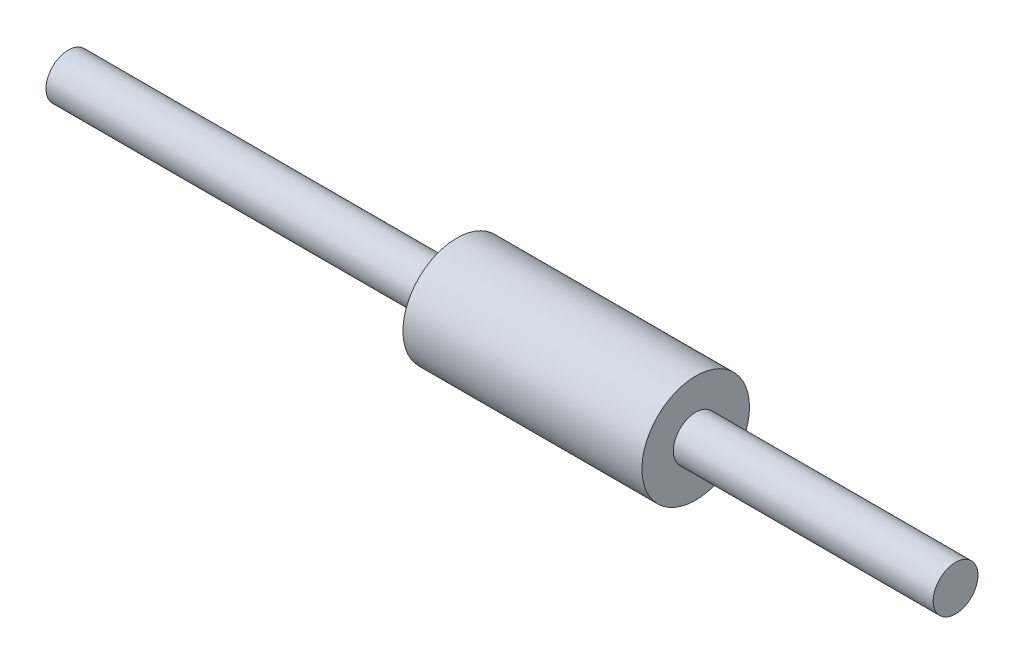
ISO-10303-21;
HEADER;
FILE_DESCRIPTION(('STEP AP214'),'2;1');
FILE_NAME('part.step','',(''),(''),'','','');
FILE_SCHEMA(('AUTOMOTIVE_DESIGN { 1 0 10303 214 1 1 1 1 }'));
ENDSEC;
DATA;
#1=APPLICATION_CONTEXT('core data for automotive mechanical design processes');
#2=APPLICATION_PROTOCOL_DEFINITION('international standard','automotive_design',2000,#1);
#3=PRODUCT_CONTEXT('',#1,'mechanical');
#4=PRODUCT('Part','Part','',(#3));
#5=PRODUCT_RELATED_PRODUCT_CATEGORY('part','',(#4));
#6=PRODUCT_DEFINITION_FORMATION('','',#4);
#7=PRODUCT_DEFINITION_CONTEXT('part definition',#1,'design');
#8=PRODUCT_DEFINITION('design','',#6,#7);
#9=PRODUCT_DEFINITION_SHAPE('','',#8);
#10=(LENGTH_UNIT() NAMED_UNIT(*) SI_UNIT(.MILLI.,.METRE.));
#11=(NAMED_UNIT(*) PLANE_ANGLE_UNIT() SI_UNIT($,.RADIAN.));
#12=(NAMED_UNIT(*) SI_UNIT($,.STERADIAN.) SOLID_ANGLE_UNIT());
#13=UNCERTAINTY_MEASURE_WITH_UNIT(LENGTH_MEASURE(1.E-05),#10,'distance_accuracy_value','');
#14=(GEOMETRIC_REPRESENTATION_CONTEXT(3) GLOBAL_UNCERTAINTY_ASSIGNED_CONTEXT((#13)) GLOBAL_UNIT_ASSIGNED_CONTEXT((#10,
#11,#12)) REPRESENTATION_CONTEXT('',''));
#15=CARTESIAN_POINT('',(0.,0.,0.));
#16=DIRECTION('',(0.,0.,1.));
#17=DIRECTION('',(1.,0.,0.));
#18=AXIS2_PLACEMENT_3D('',#15,#16,#17);
#19=CARTESIAN_POINT('',(40.,0.,0.));
#20=DIRECTION('',(-1.,0.,0.));
#21=DIRECTION('',(0.,0.,1.));
#22=AXIS2_PLACEMENT_3D('',#19,#20,#21);
#23=PLANE('',#22);
#24=CARTESIAN_POINT('',(40.,0.,0.));
#25=DIRECTION('',(1.,0.,0.));
#26=DIRECTION('',(0.,0.,-1.));
#27=AXIS2_PLACEMENT_3D('',#24,#25,#26);
#28=CIRCLE('',#27,7.5);
#29=CARTESIAN_POINT('',(40.,0.,-7.5));
#30=VERTEX_POINT('',#29);
#31=EDGE_CURVE('E61',#30,#30,#28,.T.);
#32=ORIENTED_EDGE('',*,*,#31,.F.);
#33=EDGE_LOOP('',(#32));
#34=FACE_BOUND('',#33,.T.);
#35=CARTESIAN_POINT('',(40.,0.,0.));
#36=DIRECTION('',(1.,0.,0.));
#37=DIRECTION('',(0.,0.,-1.));
#38=AXIS2_PLACEMENT_3D('',#35,#36,#37);
#39=CIRCLE('',#38,18.);
#40=CARTESIAN_POINT('',(40.,0.,-18.));
#41=VERTEX_POINT('',#40);
#42=EDGE_CURVE('E10',#41,#41,#39,.T.);
#43=ORIENTED_EDGE('',*,*,#42,.T.);
#44=EDGE_LOOP('',(#43));
#45=FACE_BOUND('',#44,.T.);
#46=ADVANCED_FACE('F33',(#34,#45),#23,.F.);
#47=CARTESIAN_POINT('',(196.356223273704,0.,0.));
#48=DIRECTION('',(1.,0.,0.));
#49=DIRECTION('',(0.,0.,-1.));
#50=AXIS2_PLACEMENT_3D('',#47,#48,#49);
#51=CYLINDRICAL_SURFACE('',#50,18.);
#52=ORIENTED_EDGE('',*,*,#42,.F.);
#53=EDGE_LOOP('',(#52));
#54=FACE_BOUND('',#53,.T.);
#55=CARTESIAN_POINT('',(-40.,0.,0.));
#56=DIRECTION('',(1.,0.,0.));
#57=DIRECTION('',(0.,0.,-1.));
#58=AXIS2_PLACEMENT_3D('',#55,#56,#57);
#59=CIRCLE('',#58,18.);
#60=CARTESIAN_POINT('',(-40.,0.,-18.));
#61=VERTEX_POINT('',#60);
#62=EDGE_CURVE('E39',#61,#61,#59,.T.);
#63=ORIENTED_EDGE('',*,*,#62,.T.);
#64=EDGE_LOOP('',(#63));
#65=FACE_BOUND('',#64,.T.);
#66=ADVANCED_FACE('F69',(#54,#65),#51,.T.);
#67=CARTESIAN_POINT('',(-40.,0.,0.));
#68=DIRECTION('',(-1.,0.,0.));
#69=DIRECTION('',(0.,0.,1.));
#70=AXIS2_PLACEMENT_3D('',#67,#68,#69);
#71=PLANE('',#70);
#72=CARTESIAN_POINT('',(-40.,0.,0.));
#73=DIRECTION('',(1.,0.,0.));
#74=DIRECTION('',(0.,0.,-1.));
#75=AXIS2_PLACEMENT_3D('',#72,#73,#74);
#76=CIRCLE('',#75,7.49999999999999);
#77=CARTESIAN_POINT('',(-40.,0.,-7.49999999999999));
#78=VERTEX_POINT('',#77);
#79=EDGE_CURVE('E43',#78,#78,#76,.T.);
#80=ORIENTED_EDGE('',*,*,#79,.T.);
#81=EDGE_LOOP('',(#80));
#82=FACE_BOUND('',#81,.T.);
#83=ORIENTED_EDGE('',*,*,#62,.F.);
#84=EDGE_LOOP('',(#83));
#85=FACE_BOUND('',#84,.T.);
#86=ADVANCED_FACE('F73',(#82,#85),#71,.T.);
#87=CARTESIAN_POINT('',(196.356223273704,0.,0.));
#88=DIRECTION('',(1.,0.,0.));
#89=DIRECTION('',(0.,0.,-1.));
#90=AXIS2_PLACEMENT_3D('',#87,#88,#89);
#91=CYLINDRICAL_SURFACE('',#90,7.5);
#92=CARTESIAN_POINT('',(-170.,0.,0.));
#93=DIRECTION('',(1.,0.,0.));
#94=DIRECTION('',(0.,0.,-1.));
#95=AXIS2_PLACEMENT_3D('',#92,#93,#94);
#96=CIRCLE('',#95,7.49999999999997);
#97=CARTESIAN_POINT('',(-170.,0.,-7.49999999999997));
#98=VERTEX_POINT('',#97);
#99=EDGE_CURVE('E47',#98,#98,#96,.T.);
#100=ORIENTED_EDGE('',*,*,#99,.T.);
#101=EDGE_LOOP('',(#100));
#102=FACE_BOUND('',#101,.T.);
#103=ORIENTED_EDGE('',*,*,#79,.F.);
#104=EDGE_LOOP('',(#103));
#105=FACE_BOUND('',#104,.T.);
#106=ADVANCED_FACE('F78',(#102,#105),#91,.T.);
#107=CARTESIAN_POINT('',(-170.,0.,0.));
#108=DIRECTION('',(-1.,0.,0.));
#109=DIRECTION('',(0.,0.,1.));
#110=AXIS2_PLACEMENT_3D('',#107,#108,#109);
#111=PLANE('',#110);
#112=CARTESIAN_POINT('',(-170.,0.,0.));
#113=DIRECTION('',(1.,0.,0.));
#114=DIRECTION('',(0.,0.,-1.));
#115=AXIS2_PLACEMENT_3D('',#112,#113,#114);
#116=CIRCLE('',#115,6.49999999999997);
#117=CARTESIAN_POINT('',(-170.,0.,-6.49999999999997));
#118=VERTEX_POINT('',#117);
#119=EDGE_CURVE('E52',#118,#118,#116,.T.);
#120=ORIENTED_EDGE('',*,*,#119,.T.);
#121=EDGE_LOOP('',(#120));
#122=FACE_BOUND('',#121,.T.);
#123=ORIENTED_EDGE('',*,*,#99,.F.);
#124=EDGE_LOOP('',(#123));
#125=FACE_BOUND('',#124,.T.);
#126=ADVANCED_FACE('F82',(#122,#125),#111,.T.);
#127=CARTESIAN_POINT('',(196.356223273704,0.,0.));
#128=DIRECTION('',(1.,0.,0.));
#129=DIRECTION('',(0.,0.,-1.));
#130=AXIS2_PLACEMENT_3D('',#127,#128,#129);
#131=CYLINDRICAL_SURFACE('',#130,6.49999999999997);
#132=CARTESIAN_POINT('',(-127.,0.,0.));
#133=DIRECTION('',(1.,0.,0.));
#134=DIRECTION('',(0.,0.,-1.));
#135=AXIS2_PLACEMENT_3D('',#132,#133,#134);
#136=CIRCLE('',#135,6.49999999999997);
#137=CARTESIAN_POINT('',(-127.,0.,-6.49999999999997));
#138=VERTEX_POINT('',#137);
#139=EDGE_CURVE('E55',#138,#138,#136,.T.);
#140=ORIENTED_EDGE('',*,*,#139,.T.);
#141=EDGE_LOOP('',(#140));
#142=FACE_BOUND('',#141,.T.);
#143=ORIENTED_EDGE('',*,*,#119,.F.);
#144=EDGE_LOOP('',(#143));
#145=FACE_BOUND('',#144,.T.);
#146=ADVANCED_FACE('F85',(#142,#145),#131,.F.);
#147=CARTESIAN_POINT('',(-127.,0.,0.));
#148=DIRECTION('',(-1.,0.,0.));
#149=DIRECTION('',(0.,0.,1.));
#150=AXIS2_PLACEMENT_3D('',#147,#148,#149);
#151=PLANE('',#150);
#152=ORIENTED_EDGE('',*,*,#139,.F.);
#153=EDGE_LOOP('',(#152));
#154=FACE_BOUND('',#153,.T.);
#155=ADVANCED_FACE('F89',(#154),#151,.T.);
#156=CARTESIAN_POINT('',(127.,0.,0.));
#157=DIRECTION('',(-1.,0.,0.));
#158=DIRECTION('',(0.,0.,1.));
#159=AXIS2_PLACEMENT_3D('',#156,#157,#158);
#160=PLANE('',#159);
#161=CARTESIAN_POINT('',(127.,0.,0.));
#162=DIRECTION('',(1.,0.,0.));
#163=DIRECTION('',(0.,0.,-1.));
#164=AXIS2_PLACEMENT_3D('',#161,#162,#163);
#165=CIRCLE('',#164,7.50000000000001);
#166=CARTESIAN_POINT('',(127.,0.,-7.50000000000001));
#167=VERTEX_POINT('',#166);
#168=EDGE_CURVE('E58',#167,#167,#165,.T.);
#169=ORIENTED_EDGE('',*,*,#168,.T.);
#170=EDGE_LOOP('',(#169));
#171=FACE_BOUND('',#170,.T.);
#172=ADVANCED_FACE('F93',(#171),#160,.F.);
#173=ORIENTED_EDGE('',*,*,#31,.T.);
#174=EDGE_LOOP('',(#173));
#175=FACE_BOUND('',#174,.T.);
#176=ORIENTED_EDGE('',*,*,#168,.F.);
#177=EDGE_LOOP('',(#176));
#178=FACE_BOUND('',#177,.T.);
#179=ADVANCED_FACE('F65',(#175,#178),#91,.T.);
#180=CLOSED_SHELL('',(#46,#66,#86,#106,#126,#146,#155,#172,#179));
#181=MANIFOLD_SOLID_BREP('B2',#180);
#182=ADVANCED_BREP_SHAPE_REPRESENTATION('',(#18,#181),#14);
#183=SHAPE_DEFINITION_REPRESENTATION(#9,#182);
ENDSEC;
END-ISO-10303-21;
